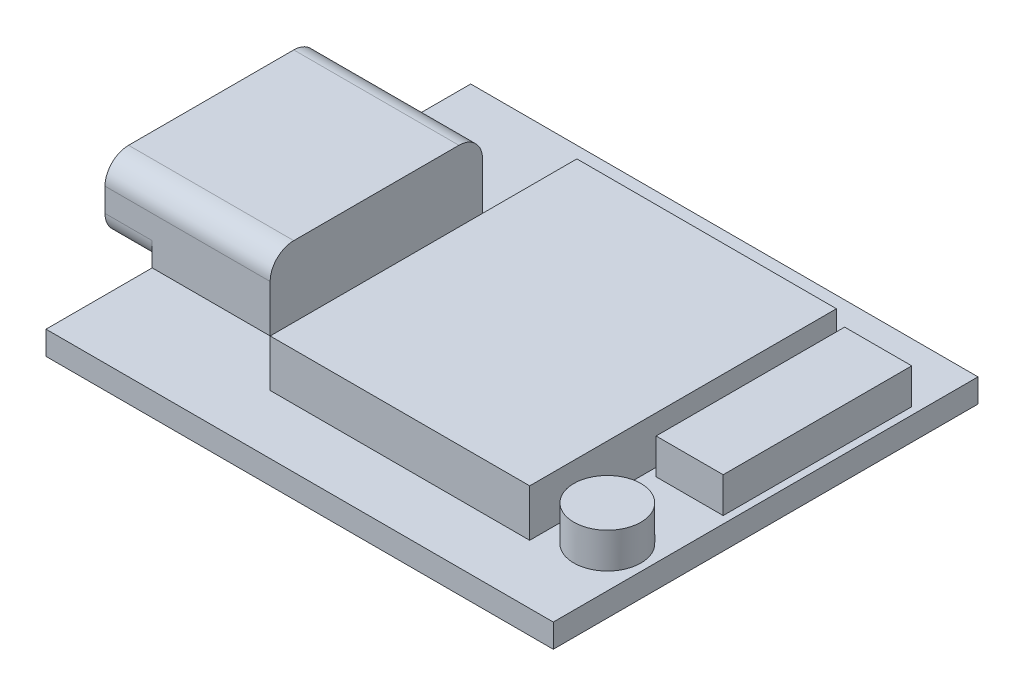
ISO-10303-21;
HEADER;
FILE_DESCRIPTION(('STEP AP214'),'2;1');
FILE_NAME('part.step','',(''),(''),'','','');
FILE_SCHEMA(('AUTOMOTIVE_DESIGN { 1 0 10303 214 1 1 1 1 }'));
ENDSEC;
DATA;
#1=APPLICATION_CONTEXT('core data for automotive mechanical design processes');
#2=APPLICATION_PROTOCOL_DEFINITION('international standard','automotive_design',2000,#1);
#3=PRODUCT_CONTEXT('',#1,'mechanical');
#4=PRODUCT('Part','Part','',(#3));
#5=PRODUCT_RELATED_PRODUCT_CATEGORY('part','',(#4));
#6=PRODUCT_DEFINITION_FORMATION('','',#4);
#7=PRODUCT_DEFINITION_CONTEXT('part definition',#1,'design');
#8=PRODUCT_DEFINITION('design','',#6,#7);
#9=PRODUCT_DEFINITION_SHAPE('','',#8);
#10=(LENGTH_UNIT() NAMED_UNIT(*) SI_UNIT(.MILLI.,.METRE.));
#11=(NAMED_UNIT(*) PLANE_ANGLE_UNIT() SI_UNIT($,.RADIAN.));
#12=(NAMED_UNIT(*) SI_UNIT($,.STERADIAN.) SOLID_ANGLE_UNIT());
#13=UNCERTAINTY_MEASURE_WITH_UNIT(LENGTH_MEASURE(1.E-05),#10,'distance_accuracy_value','');
#14=(GEOMETRIC_REPRESENTATION_CONTEXT(3) GLOBAL_UNCERTAINTY_ASSIGNED_CONTEXT((#13)) GLOBAL_UNIT_ASSIGNED_CONTEXT((#10,
#11,#12)) REPRESENTATION_CONTEXT('',''));
#15=CARTESIAN_POINT('',(0.,0.,0.));
#16=DIRECTION('',(0.,0.,1.));
#17=DIRECTION('',(1.,0.,0.));
#18=AXIS2_PLACEMENT_3D('',#15,#16,#17);
#19=CARTESIAN_POINT('',(0.,1.,0.));
#20=DIRECTION('',(0.,-1.,0.));
#21=DIRECTION('',(0.,0.,-1.));
#22=AXIS2_PLACEMENT_3D('',#19,#20,#21);
#23=PLANE('',#22);
#24=CARTESIAN_POINT('',(9.02059135131175,1.,4.97840063316199));
#25=DIRECTION('',(0.,-1.,0.));
#26=DIRECTION('',(0.,0.,-1.));
#27=AXIS2_PLACEMENT_3D('',#24,#25,#26);
#28=CIRCLE('',#27,1.42148493775175);
#29=CARTESIAN_POINT('',(9.02059135131175,1.,3.55691569541023));
#30=VERTEX_POINT('',#29);
#31=EDGE_CURVE('E11',#30,#30,#28,.F.);
#32=ORIENTED_EDGE('',*,*,#31,.F.);
#33=EDGE_LOOP('',(#32));
#34=FACE_BOUND('',#33,.T.);
#35=DIRECTION('',(0.,0.,1.));
#36=VECTOR('',#35,1.);
#37=CARTESIAN_POINT('',(-3.75,1.,6.5));
#38=LINE('',#37,#36);
#39=CARTESIAN_POINT('',(-3.75,1.,-6.5));
#40=VERTEX_POINT('',#39);
#41=CARTESIAN_POINT('',(-3.75,1.,6.5));
#42=VERTEX_POINT('',#41);
#43=EDGE_CURVE('E209',#40,#42,#38,.T.);
#44=ORIENTED_EDGE('',*,*,#43,.F.);
#45=DIRECTION('',(-1.,0.,0.));
#46=VECTOR('',#45,1.);
#47=CARTESIAN_POINT('',(7.25,1.,-6.5));
#48=LINE('',#47,#46);
#49=CARTESIAN_POINT('',(7.25,1.,-6.5));
#50=VERTEX_POINT('',#49);
#51=EDGE_CURVE('E222',#50,#40,#48,.T.);
#52=ORIENTED_EDGE('',*,*,#51,.F.);
#53=DIRECTION('',(0.,0.,-1.));
#54=VECTOR('',#53,1.);
#55=CARTESIAN_POINT('',(7.25,1.,6.5));
#56=LINE('',#55,#54);
#57=CARTESIAN_POINT('',(7.25,1.,6.5));
#58=VERTEX_POINT('',#57);
#59=EDGE_CURVE('E231',#58,#50,#56,.T.);
#60=ORIENTED_EDGE('',*,*,#59,.F.);
#61=DIRECTION('',(1.,0.,0.));
#62=VECTOR('',#61,1.);
#63=CARTESIAN_POINT('',(7.25,1.,6.5));
#64=LINE('',#63,#62);
#65=EDGE_CURVE('E212',#42,#58,#64,.T.);
#66=ORIENTED_EDGE('',*,*,#65,.F.);
#67=EDGE_LOOP('',(#44,#52,#60,#66));
#68=FACE_BOUND('',#67,.T.);
#69=DIRECTION('',(-1.,0.,0.));
#70=VECTOR('',#69,1.);
#71=CARTESIAN_POINT('',(-12.75,1.,-4.5));
#72=LINE('',#71,#70);
#73=CARTESIAN_POINT('',(-5.75,1.,-4.5));
#74=VERTEX_POINT('',#73);
#75=CARTESIAN_POINT('',(-10.75,1.,-4.5));
#76=VERTEX_POINT('',#75);
#77=EDGE_CURVE('E252',#74,#76,#72,.T.);
#78=ORIENTED_EDGE('',*,*,#77,.F.);
#79=DIRECTION('',(0.,0.,-1.));
#80=VECTOR('',#79,1.);
#81=CARTESIAN_POINT('',(-5.75,1.,-4.5));
#82=LINE('',#81,#80);
#83=CARTESIAN_POINT('',(-5.75,1.,4.5));
#84=VERTEX_POINT('',#83);
#85=EDGE_CURVE('E258',#84,#74,#82,.T.);
#86=ORIENTED_EDGE('',*,*,#85,.F.);
#87=DIRECTION('',(1.,0.,0.));
#88=VECTOR('',#87,1.);
#89=CARTESIAN_POINT('',(-12.75,1.,4.5));
#90=LINE('',#89,#88);
#91=CARTESIAN_POINT('',(-10.75,1.,4.5));
#92=VERTEX_POINT('',#91);
#93=EDGE_CURVE('E259',#92,#84,#90,.T.);
#94=ORIENTED_EDGE('',*,*,#93,.F.);
#95=DIRECTION('',(0.,0.,1.));
#96=VECTOR('',#95,1.);
#97=CARTESIAN_POINT('',(-10.75,1.,-9.));
#98=LINE('',#97,#96);
#99=CARTESIAN_POINT('',(-10.75,1.,9.));
#100=VERTEX_POINT('',#99);
#101=EDGE_CURVE('E283',#92,#100,#98,.T.);
#102=ORIENTED_EDGE('',*,*,#101,.T.);
#103=DIRECTION('',(1.,0.,0.));
#104=VECTOR('',#103,1.);
#105=CARTESIAN_POINT('',(10.75,1.,9.));
#106=LINE('',#105,#104);
#107=CARTESIAN_POINT('',(10.75,1.,9.));
#108=VERTEX_POINT('',#107);
#109=EDGE_CURVE('E281',#100,#108,#106,.T.);
#110=ORIENTED_EDGE('',*,*,#109,.T.);
#111=DIRECTION('',(0.,0.,-1.));
#112=VECTOR('',#111,1.);
#113=CARTESIAN_POINT('',(10.75,1.,-9.));
#114=LINE('',#113,#112);
#115=CARTESIAN_POINT('',(10.75,1.,-9.));
#116=VERTEX_POINT('',#115);
#117=EDGE_CURVE('E285',#108,#116,#114,.T.);
#118=ORIENTED_EDGE('',*,*,#117,.T.);
#119=DIRECTION('',(-1.,0.,0.));
#120=VECTOR('',#119,1.);
#121=CARTESIAN_POINT('',(10.75,1.,-9.));
#122=LINE('',#121,#120);
#123=CARTESIAN_POINT('',(-10.75,1.,-9.));
#124=VERTEX_POINT('',#123);
#125=EDGE_CURVE('E287',#116,#124,#122,.T.);
#126=ORIENTED_EDGE('',*,*,#125,.T.);
#127=EDGE_CURVE('E278',#124,#76,#98,.T.);
#128=ORIENTED_EDGE('',*,*,#127,.T.);
#129=EDGE_LOOP('',(#78,#86,#94,#102,#110,#118,#126,#128));
#130=FACE_BOUND('',#129,.T.);
#131=DIRECTION('',(0.,0.,1.));
#132=VECTOR('',#131,1.);
#133=CARTESIAN_POINT('',(7.59910641356,1.,-6.5));
#134=LINE('',#133,#132);
#135=CARTESIAN_POINT('',(7.59910641356,1.,-6.5));
#136=VERTEX_POINT('',#135);
#137=CARTESIAN_POINT('',(7.59910641356,1.,1.49168172480123));
#138=VERTEX_POINT('',#137);
#139=EDGE_CURVE('E208',#136,#138,#134,.T.);
#140=ORIENTED_EDGE('',*,*,#139,.F.);
#141=DIRECTION('',(-1.,0.,0.));
#142=VECTOR('',#141,1.);
#143=CARTESIAN_POINT('',(7.59910641356,1.,-6.5));
#144=LINE('',#143,#142);
#145=CARTESIAN_POINT('',(10.4420762890635,1.,-6.5));
#146=VERTEX_POINT('',#145);
#147=EDGE_CURVE('E205',#146,#136,#144,.T.);
#148=ORIENTED_EDGE('',*,*,#147,.F.);
#149=DIRECTION('',(0.,0.,-1.));
#150=VECTOR('',#149,1.);
#151=CARTESIAN_POINT('',(10.4420762890635,1.,-6.5));
#152=LINE('',#151,#150);
#153=CARTESIAN_POINT('',(10.4420762890635,1.,1.49168172480123));
#154=VERTEX_POINT('',#153);
#155=EDGE_CURVE('E59',#154,#146,#152,.T.);
#156=ORIENTED_EDGE('',*,*,#155,.F.);
#157=DIRECTION('',(1.,0.,0.));
#158=VECTOR('',#157,1.);
#159=CARTESIAN_POINT('',(7.59910641356,1.,1.49168172480123));
#160=LINE('',#159,#158);
#161=EDGE_CURVE('E54',#138,#154,#160,.T.);
#162=ORIENTED_EDGE('',*,*,#161,.F.);
#163=EDGE_LOOP('',(#140,#148,#156,#162));
#164=FACE_BOUND('',#163,.T.);
#165=ADVANCED_FACE('F39',(#34,#68,#130,#164),#23,.F.);
#166=CARTESIAN_POINT('',(-10.75,1.,-9.));
#167=DIRECTION('',(1.,0.,0.));
#168=DIRECTION('',(0.,0.,-1.));
#169=AXIS2_PLACEMENT_3D('',#166,#167,#168);
#170=PLANE('',#169);
#171=DIRECTION('',(0.,0.,1.));
#172=VECTOR('',#171,1.);
#173=CARTESIAN_POINT('',(-10.75,0.,-9.));
#174=LINE('',#173,#172);
#175=CARTESIAN_POINT('',(-10.75,0.,-9.));
#176=VERTEX_POINT('',#175);
#177=CARTESIAN_POINT('',(-10.75,0.,9.));
#178=VERTEX_POINT('',#177);
#179=EDGE_CURVE('E277',#176,#178,#174,.T.);
#180=ORIENTED_EDGE('',*,*,#179,.T.);
#181=DIRECTION('',(0.,-1.,0.));
#182=VECTOR('',#181,1.);
#183=CARTESIAN_POINT('',(-10.75,1.,9.));
#184=LINE('',#183,#182);
#185=EDGE_CURVE('E263',#100,#178,#184,.T.);
#186=ORIENTED_EDGE('',*,*,#185,.F.);
#187=ORIENTED_EDGE('',*,*,#101,.F.);
#188=DIRECTION('',(0.,-1.,0.));
#189=VECTOR('',#188,1.);
#190=CARTESIAN_POINT('',(-10.75,4.,4.5));
#191=LINE('',#190,#189);
#192=CARTESIAN_POINT('',(-10.75,2.,4.5));
#193=VERTEX_POINT('',#192);
#194=EDGE_CURVE('E329',#193,#92,#191,.T.);
#195=ORIENTED_EDGE('',*,*,#194,.F.);
#196=CARTESIAN_POINT('',(-10.75,2.,3.5));
#197=DIRECTION('',(1.,0.,0.));
#198=DIRECTION('',(0.,0.,-1.));
#199=AXIS2_PLACEMENT_3D('',#196,#197,#198);
#200=CIRCLE('',#199,1.);
#201=CARTESIAN_POINT('',(-10.75,1.,3.5));
#202=VERTEX_POINT('',#201);
#203=EDGE_CURVE('E47',#193,#202,#200,.T.);
#204=ORIENTED_EDGE('',*,*,#203,.T.);
#205=CARTESIAN_POINT('',(-10.75,1.,-3.5));
#206=VERTEX_POINT('',#205);
#207=EDGE_CURVE('E282',#206,#202,#98,.T.);
#208=ORIENTED_EDGE('',*,*,#207,.F.);
#209=CARTESIAN_POINT('',(-10.75,2.,-3.5));
#210=DIRECTION('',(1.,0.,0.));
#211=DIRECTION('',(0.,0.,-1.));
#212=AXIS2_PLACEMENT_3D('',#209,#210,#211);
#213=CIRCLE('',#212,1.);
#214=CARTESIAN_POINT('',(-10.75,2.,-4.5));
#215=VERTEX_POINT('',#214);
#216=EDGE_CURVE('E344',#206,#215,#213,.T.);
#217=ORIENTED_EDGE('',*,*,#216,.T.);
#218=DIRECTION('',(0.,1.,0.));
#219=VECTOR('',#218,1.);
#220=CARTESIAN_POINT('',(-10.75,4.,-4.5));
#221=LINE('',#220,#219);
#222=EDGE_CURVE('E309',#76,#215,#221,.T.);
#223=ORIENTED_EDGE('',*,*,#222,.F.);
#224=ORIENTED_EDGE('',*,*,#127,.F.);
#225=DIRECTION('',(0.,-1.,0.));
#226=VECTOR('',#225,1.);
#227=CARTESIAN_POINT('',(-10.75,1.,-9.));
#228=LINE('',#227,#226);
#229=EDGE_CURVE('E289',#124,#176,#228,.T.);
#230=ORIENTED_EDGE('',*,*,#229,.T.);
#231=EDGE_LOOP('',(#180,#186,#187,#195,#204,#208,#217,#223,#224,#230));
#232=FACE_BOUND('',#231,.T.);
#233=ADVANCED_FACE('F349',(#232),#170,.F.);
#234=CARTESIAN_POINT('',(10.75,1.,9.));
#235=DIRECTION('',(0.,0.,-1.));
#236=DIRECTION('',(-1.,0.,0.));
#237=AXIS2_PLACEMENT_3D('',#234,#235,#236);
#238=PLANE('',#237);
#239=DIRECTION('',(1.,0.,0.));
#240=VECTOR('',#239,1.);
#241=CARTESIAN_POINT('',(10.75,0.,9.));
#242=LINE('',#241,#240);
#243=CARTESIAN_POINT('',(10.75,0.,9.));
#244=VERTEX_POINT('',#243);
#245=EDGE_CURVE('E292',#178,#244,#242,.T.);
#246=ORIENTED_EDGE('',*,*,#245,.T.);
#247=DIRECTION('',(0.,-1.,0.));
#248=VECTOR('',#247,1.);
#249=CARTESIAN_POINT('',(10.75,1.,9.));
#250=LINE('',#249,#248);
#251=EDGE_CURVE('E303',#108,#244,#250,.T.);
#252=ORIENTED_EDGE('',*,*,#251,.F.);
#253=ORIENTED_EDGE('',*,*,#109,.F.);
#254=ORIENTED_EDGE('',*,*,#185,.T.);
#255=EDGE_LOOP('',(#246,#252,#253,#254));
#256=FACE_BOUND('',#255,.T.);
#257=ADVANCED_FACE('F406',(#256),#238,.F.);
#258=CARTESIAN_POINT('',(10.75,1.,-9.));
#259=DIRECTION('',(-1.,0.,0.));
#260=DIRECTION('',(0.,0.,1.));
#261=AXIS2_PLACEMENT_3D('',#258,#259,#260);
#262=PLANE('',#261);
#263=DIRECTION('',(0.,0.,-1.));
#264=VECTOR('',#263,1.);
#265=CARTESIAN_POINT('',(10.75,0.,-9.));
#266=LINE('',#265,#264);
#267=CARTESIAN_POINT('',(10.75,0.,-9.));
#268=VERTEX_POINT('',#267);
#269=EDGE_CURVE('E294',#244,#268,#266,.T.);
#270=ORIENTED_EDGE('',*,*,#269,.T.);
#271=DIRECTION('',(0.,-1.,0.));
#272=VECTOR('',#271,1.);
#273=CARTESIAN_POINT('',(10.75,1.,-9.));
#274=LINE('',#273,#272);
#275=EDGE_CURVE('E300',#116,#268,#274,.T.);
#276=ORIENTED_EDGE('',*,*,#275,.F.);
#277=ORIENTED_EDGE('',*,*,#117,.F.);
#278=ORIENTED_EDGE('',*,*,#251,.T.);
#279=EDGE_LOOP('',(#270,#276,#277,#278));
#280=FACE_BOUND('',#279,.T.);
#281=ADVANCED_FACE('F433',(#280),#262,.F.);
#282=CARTESIAN_POINT('',(10.75,1.,-9.));
#283=DIRECTION('',(0.,0.,1.));
#284=DIRECTION('',(1.,0.,0.));
#285=AXIS2_PLACEMENT_3D('',#282,#283,#284);
#286=PLANE('',#285);
#287=DIRECTION('',(-1.,0.,0.));
#288=VECTOR('',#287,1.);
#289=CARTESIAN_POINT('',(10.75,0.,-9.));
#290=LINE('',#289,#288);
#291=EDGE_CURVE('E296',#268,#176,#290,.T.);
#292=ORIENTED_EDGE('',*,*,#291,.T.);
#293=ORIENTED_EDGE('',*,*,#229,.F.);
#294=ORIENTED_EDGE('',*,*,#125,.F.);
#295=ORIENTED_EDGE('',*,*,#275,.T.);
#296=EDGE_LOOP('',(#292,#293,#294,#295));
#297=FACE_BOUND('',#296,.T.);
#298=ADVANCED_FACE('F396',(#297),#286,.F.);
#299=CARTESIAN_POINT('',(0.,0.,0.));
#300=DIRECTION('',(0.,-1.,0.));
#301=DIRECTION('',(0.,0.,-1.));
#302=AXIS2_PLACEMENT_3D('',#299,#300,#301);
#303=PLANE('',#302);
#304=ORIENTED_EDGE('',*,*,#179,.F.);
#305=ORIENTED_EDGE('',*,*,#291,.F.);
#306=ORIENTED_EDGE('',*,*,#269,.F.);
#307=ORIENTED_EDGE('',*,*,#245,.F.);
#308=EDGE_LOOP('',(#304,#305,#306,#307));
#309=FACE_BOUND('',#308,.T.);
#310=ADVANCED_FACE('F401',(#309),#303,.T.);
#311=CARTESIAN_POINT('',(0.,1.,0.));
#312=DIRECTION('',(0.,1.,0.));
#313=DIRECTION('',(0.,0.,1.));
#314=AXIS2_PLACEMENT_3D('',#311,#312,#313);
#315=PLANE('',#314);
#316=DIRECTION('',(0.,0.,1.));
#317=VECTOR('',#316,1.);
#318=CARTESIAN_POINT('',(-12.75,1.,-4.5));
#319=LINE('',#318,#317);
#320=CARTESIAN_POINT('',(-12.75,1.,-3.5));
#321=VERTEX_POINT('',#320);
#322=CARTESIAN_POINT('',(-12.75,1.,3.5));
#323=VERTEX_POINT('',#322);
#324=EDGE_CURVE('E247',#321,#323,#319,.T.);
#325=ORIENTED_EDGE('',*,*,#324,.F.);
#326=DIRECTION('',(-1.,0.,0.));
#327=VECTOR('',#326,1.);
#328=CARTESIAN_POINT('',(0.,1.,-3.5));
#329=LINE('',#328,#327);
#330=EDGE_CURVE('E325',#321,#206,#329,.F.);
#331=ORIENTED_EDGE('',*,*,#330,.T.);
#332=ORIENTED_EDGE('',*,*,#207,.T.);
#333=DIRECTION('',(1.,0.,0.));
#334=VECTOR('',#333,1.);
#335=CARTESIAN_POINT('',(0.,1.,3.5));
#336=LINE('',#335,#334);
#337=EDGE_CURVE('E323',#202,#323,#336,.F.);
#338=ORIENTED_EDGE('',*,*,#337,.T.);
#339=EDGE_LOOP('',(#325,#331,#332,#338));
#340=FACE_BOUND('',#339,.T.);
#341=ADVANCED_FACE('F357',(#340),#315,.F.);
#342=CARTESIAN_POINT('',(-12.75,4.,-4.5));
#343=DIRECTION('',(1.,0.,0.));
#344=DIRECTION('',(0.,0.,-1.));
#345=AXIS2_PLACEMENT_3D('',#342,#343,#344);
#346=PLANE('',#345);
#347=DIRECTION('',(0.,-1.,0.));
#348=VECTOR('',#347,1.);
#349=CARTESIAN_POINT('',(-12.75,4.,-4.5));
#350=LINE('',#349,#348);
#351=CARTESIAN_POINT('',(-12.75,3.,-4.5));
#352=VERTEX_POINT('',#351);
#353=CARTESIAN_POINT('',(-12.75,2.,-4.5));
#354=VERTEX_POINT('',#353);
#355=EDGE_CURVE('E255',#352,#354,#350,.T.);
#356=ORIENTED_EDGE('',*,*,#355,.T.);
#357=CARTESIAN_POINT('',(-12.75,2.,-3.5));
#358=DIRECTION('',(1.,0.,0.));
#359=DIRECTION('',(0.,0.,-1.));
#360=AXIS2_PLACEMENT_3D('',#357,#358,#359);
#361=CIRCLE('',#360,1.);
#362=EDGE_CURVE('E321',#354,#321,#361,.F.);
#363=ORIENTED_EDGE('',*,*,#362,.T.);
#364=ORIENTED_EDGE('',*,*,#324,.T.);
#365=CARTESIAN_POINT('',(-12.75,2.,3.5));
#366=DIRECTION('',(1.,0.,0.));
#367=DIRECTION('',(0.,0.,-1.));
#368=AXIS2_PLACEMENT_3D('',#365,#366,#367);
#369=CIRCLE('',#368,1.);
#370=CARTESIAN_POINT('',(-12.75,2.,4.5));
#371=VERTEX_POINT('',#370);
#372=EDGE_CURVE('E319',#323,#371,#369,.F.);
#373=ORIENTED_EDGE('',*,*,#372,.T.);
#374=DIRECTION('',(0.,-1.,0.));
#375=VECTOR('',#374,1.);
#376=CARTESIAN_POINT('',(-12.75,4.,4.5));
#377=LINE('',#376,#375);
#378=CARTESIAN_POINT('',(-12.75,3.,4.5));
#379=VERTEX_POINT('',#378);
#380=EDGE_CURVE('E274',#379,#371,#377,.T.);
#381=ORIENTED_EDGE('',*,*,#380,.F.);
#382=CARTESIAN_POINT('',(-12.75,3.,3.5));
#383=DIRECTION('',(1.,0.,0.));
#384=DIRECTION('',(0.,0.,-1.));
#385=AXIS2_PLACEMENT_3D('',#382,#383,#384);
#386=CIRCLE('',#385,1.);
#387=CARTESIAN_POINT('',(-12.75,4.,3.5));
#388=VERTEX_POINT('',#387);
#389=EDGE_CURVE('E315',#379,#388,#386,.F.);
#390=ORIENTED_EDGE('',*,*,#389,.T.);
#391=DIRECTION('',(0.,0.,1.));
#392=VECTOR('',#391,1.);
#393=CARTESIAN_POINT('',(-12.75,4.,-4.5));
#394=LINE('',#393,#392);
#395=CARTESIAN_POINT('',(-12.75,4.,-3.5));
#396=VERTEX_POINT('',#395);
#397=EDGE_CURVE('E248',#396,#388,#394,.T.);
#398=ORIENTED_EDGE('',*,*,#397,.F.);
#399=CARTESIAN_POINT('',(-12.75,3.,-3.5));
#400=DIRECTION('',(1.,0.,0.));
#401=DIRECTION('',(0.,0.,-1.));
#402=AXIS2_PLACEMENT_3D('',#399,#400,#401);
#403=CIRCLE('',#402,1.);
#404=EDGE_CURVE('E317',#396,#352,#403,.F.);
#405=ORIENTED_EDGE('',*,*,#404,.T.);
#406=EDGE_LOOP('',(#356,#363,#364,#373,#381,#390,#398,#405));
#407=FACE_BOUND('',#406,.T.);
#408=ADVANCED_FACE('F363',(#407),#346,.F.);
#409=CARTESIAN_POINT('',(-12.75,4.,4.5));
#410=DIRECTION('',(0.,0.,-1.));
#411=DIRECTION('',(-1.,0.,0.));
#412=AXIS2_PLACEMENT_3D('',#409,#410,#411);
#413=PLANE('',#412);
#414=ORIENTED_EDGE('',*,*,#380,.T.);
#415=DIRECTION('',(1.,0.,0.));
#416=VECTOR('',#415,1.);
#417=CARTESIAN_POINT('',(-12.75,2.,4.5));
#418=LINE('',#417,#416);
#419=EDGE_CURVE('E331',#371,#193,#418,.T.);
#420=ORIENTED_EDGE('',*,*,#419,.T.);
#421=ORIENTED_EDGE('',*,*,#194,.T.);
#422=ORIENTED_EDGE('',*,*,#93,.T.);
#423=DIRECTION('',(0.,-1.,0.));
#424=VECTOR('',#423,1.);
#425=CARTESIAN_POINT('',(-5.75,4.,4.5));
#426=LINE('',#425,#424);
#427=CARTESIAN_POINT('',(-5.75,3.,4.5));
#428=VERTEX_POINT('',#427);
#429=EDGE_CURVE('E272',#428,#84,#426,.T.);
#430=ORIENTED_EDGE('',*,*,#429,.F.);
#431=DIRECTION('',(1.,0.,0.));
#432=VECTOR('',#431,1.);
#433=CARTESIAN_POINT('',(-12.75,3.,4.5));
#434=LINE('',#433,#432);
#435=EDGE_CURVE('E327',#428,#379,#434,.F.);
#436=ORIENTED_EDGE('',*,*,#435,.T.);
#437=EDGE_LOOP('',(#414,#420,#421,#422,#430,#436));
#438=FACE_BOUND('',#437,.T.);
#439=ADVANCED_FACE('F366',(#438),#413,.F.);
#440=CARTESIAN_POINT('',(-5.75,4.,-4.5));
#441=DIRECTION('',(-1.,0.,0.));
#442=DIRECTION('',(0.,0.,1.));
#443=AXIS2_PLACEMENT_3D('',#440,#441,#442);
#444=PLANE('',#443);
#445=DIRECTION('',(0.,-1.,0.));
#446=VECTOR('',#445,1.);
#447=CARTESIAN_POINT('',(-5.75,4.,-4.5));
#448=LINE('',#447,#446);
#449=CARTESIAN_POINT('',(-5.75,3.,-4.5));
#450=VERTEX_POINT('',#449);
#451=EDGE_CURVE('E270',#450,#74,#448,.T.);
#452=ORIENTED_EDGE('',*,*,#451,.F.);
#453=CARTESIAN_POINT('',(-5.75,3.,-3.5));
#454=DIRECTION('',(-1.,0.,0.));
#455=DIRECTION('',(0.,0.,1.));
#456=AXIS2_PLACEMENT_3D('',#453,#454,#455);
#457=CIRCLE('',#456,1.);
#458=CARTESIAN_POINT('',(-5.75,4.,-3.5));
#459=VERTEX_POINT('',#458);
#460=EDGE_CURVE('E342',#450,#459,#457,.F.);
#461=ORIENTED_EDGE('',*,*,#460,.T.);
#462=DIRECTION('',(0.,0.,-1.));
#463=VECTOR('',#462,1.);
#464=CARTESIAN_POINT('',(-5.75,4.,-4.5));
#465=LINE('',#464,#463);
#466=CARTESIAN_POINT('',(-5.75,4.,3.5));
#467=VERTEX_POINT('',#466);
#468=EDGE_CURVE('E251',#467,#459,#465,.T.);
#469=ORIENTED_EDGE('',*,*,#468,.F.);
#470=CARTESIAN_POINT('',(-5.75,3.,3.5));
#471=DIRECTION('',(-1.,0.,0.));
#472=DIRECTION('',(0.,0.,1.));
#473=AXIS2_PLACEMENT_3D('',#470,#471,#472);
#474=CIRCLE('',#473,1.);
#475=EDGE_CURVE('E340',#467,#428,#474,.F.);
#476=ORIENTED_EDGE('',*,*,#475,.T.);
#477=ORIENTED_EDGE('',*,*,#429,.T.);
#478=ORIENTED_EDGE('',*,*,#85,.T.);
#479=EDGE_LOOP('',(#452,#461,#469,#476,#477,#478));
#480=FACE_BOUND('',#479,.T.);
#481=ADVANCED_FACE('F409',(#480),#444,.F.);
#482=CARTESIAN_POINT('',(-12.75,4.,-4.5));
#483=DIRECTION('',(0.,0.,1.));
#484=DIRECTION('',(1.,0.,0.));
#485=AXIS2_PLACEMENT_3D('',#482,#483,#484);
#486=PLANE('',#485);
#487=ORIENTED_EDGE('',*,*,#222,.T.);
#488=DIRECTION('',(-1.,0.,0.));
#489=VECTOR('',#488,1.);
#490=CARTESIAN_POINT('',(-12.75,2.,-4.5));
#491=LINE('',#490,#489);
#492=EDGE_CURVE('E312',#215,#354,#491,.T.);
#493=ORIENTED_EDGE('',*,*,#492,.T.);
#494=ORIENTED_EDGE('',*,*,#355,.F.);
#495=DIRECTION('',(-1.,0.,0.));
#496=VECTOR('',#495,1.);
#497=CARTESIAN_POINT('',(-5.75,3.,-4.5));
#498=LINE('',#497,#496);
#499=EDGE_CURVE('E262',#352,#450,#498,.F.);
#500=ORIENTED_EDGE('',*,*,#499,.T.);
#501=ORIENTED_EDGE('',*,*,#451,.T.);
#502=ORIENTED_EDGE('',*,*,#77,.T.);
#503=EDGE_LOOP('',(#487,#493,#494,#500,#501,#502));
#504=FACE_BOUND('',#503,.T.);
#505=ADVANCED_FACE('F382',(#504),#486,.F.);
#506=CARTESIAN_POINT('',(0.,4.,0.));
#507=DIRECTION('',(0.,1.,0.));
#508=DIRECTION('',(0.,0.,1.));
#509=AXIS2_PLACEMENT_3D('',#506,#507,#508);
#510=PLANE('',#509);
#511=ORIENTED_EDGE('',*,*,#468,.T.);
#512=DIRECTION('',(-1.,0.,0.));
#513=VECTOR('',#512,1.);
#514=CARTESIAN_POINT('',(-12.75,4.,-3.5));
#515=LINE('',#514,#513);
#516=EDGE_CURVE('E337',#459,#396,#515,.T.);
#517=ORIENTED_EDGE('',*,*,#516,.T.);
#518=ORIENTED_EDGE('',*,*,#397,.T.);
#519=DIRECTION('',(1.,0.,0.));
#520=VECTOR('',#519,1.);
#521=CARTESIAN_POINT('',(-5.75,4.,3.5));
#522=LINE('',#521,#520);
#523=EDGE_CURVE('E334',#388,#467,#522,.T.);
#524=ORIENTED_EDGE('',*,*,#523,.T.);
#525=EDGE_LOOP('',(#511,#517,#518,#524));
#526=FACE_BOUND('',#525,.T.);
#527=ADVANCED_FACE('F373',(#526),#510,.T.);
#528=CARTESIAN_POINT('',(-12.75,2.,-3.5));
#529=DIRECTION('',(-1.,0.,0.));
#530=DIRECTION('',(0.,0.,1.));
#531=AXIS2_PLACEMENT_3D('',#528,#529,#530);
#532=CYLINDRICAL_SURFACE('',#531,1.);
#533=ORIENTED_EDGE('',*,*,#216,.F.);
#534=ORIENTED_EDGE('',*,*,#330,.F.);
#535=ORIENTED_EDGE('',*,*,#362,.F.);
#536=ORIENTED_EDGE('',*,*,#492,.F.);
#537=EDGE_LOOP('',(#533,#534,#535,#536));
#538=FACE_BOUND('',#537,.T.);
#539=ADVANCED_FACE('F386',(#538),#532,.T.);
#540=CARTESIAN_POINT('',(-12.75,2.,3.5));
#541=DIRECTION('',(1.,0.,0.));
#542=DIRECTION('',(0.,0.,-1.));
#543=AXIS2_PLACEMENT_3D('',#540,#541,#542);
#544=CYLINDRICAL_SURFACE('',#543,1.);
#545=ORIENTED_EDGE('',*,*,#372,.F.);
#546=ORIENTED_EDGE('',*,*,#337,.F.);
#547=ORIENTED_EDGE('',*,*,#203,.F.);
#548=ORIENTED_EDGE('',*,*,#419,.F.);
#549=EDGE_LOOP('',(#545,#546,#547,#548));
#550=FACE_BOUND('',#549,.T.);
#551=ADVANCED_FACE('F360',(#550),#544,.T.);
#552=CARTESIAN_POINT('',(0.,3.,-3.5));
#553=DIRECTION('',(1.,0.,0.));
#554=DIRECTION('',(0.,0.,-1.));
#555=AXIS2_PLACEMENT_3D('',#552,#553,#554);
#556=CYLINDRICAL_SURFACE('',#555,1.);
#557=ORIENTED_EDGE('',*,*,#460,.F.);
#558=ORIENTED_EDGE('',*,*,#499,.F.);
#559=ORIENTED_EDGE('',*,*,#404,.F.);
#560=ORIENTED_EDGE('',*,*,#516,.F.);
#561=EDGE_LOOP('',(#557,#558,#559,#560));
#562=FACE_BOUND('',#561,.T.);
#563=ADVANCED_FACE('F378',(#562),#556,.T.);
#564=CARTESIAN_POINT('',(0.,3.,3.5));
#565=DIRECTION('',(-1.,0.,0.));
#566=DIRECTION('',(0.,0.,1.));
#567=AXIS2_PLACEMENT_3D('',#564,#565,#566);
#568=CYLINDRICAL_SURFACE('',#567,1.);
#569=ORIENTED_EDGE('',*,*,#389,.F.);
#570=ORIENTED_EDGE('',*,*,#435,.F.);
#571=ORIENTED_EDGE('',*,*,#475,.F.);
#572=ORIENTED_EDGE('',*,*,#523,.F.);
#573=EDGE_LOOP('',(#569,#570,#571,#572));
#574=FACE_BOUND('',#573,.T.);
#575=ADVANCED_FACE('F41',(#574),#568,.T.);
#576=CARTESIAN_POINT('',(-3.75,3.,6.5));
#577=DIRECTION('',(1.,0.,0.));
#578=DIRECTION('',(0.,0.,-1.));
#579=AXIS2_PLACEMENT_3D('',#576,#577,#578);
#580=PLANE('',#579);
#581=ORIENTED_EDGE('',*,*,#43,.T.);
#582=DIRECTION('',(0.,-1.,0.));
#583=VECTOR('',#582,1.);
#584=CARTESIAN_POINT('',(-3.75,3.,6.5));
#585=LINE('',#584,#583);
#586=CARTESIAN_POINT('',(-3.75,3.,6.5));
#587=VERTEX_POINT('',#586);
#588=EDGE_CURVE('E244',#587,#42,#585,.T.);
#589=ORIENTED_EDGE('',*,*,#588,.F.);
#590=DIRECTION('',(0.,0.,1.));
#591=VECTOR('',#590,1.);
#592=CARTESIAN_POINT('',(-3.75,3.,6.5));
#593=LINE('',#592,#591);
#594=CARTESIAN_POINT('',(-3.75,3.,-6.5));
#595=VERTEX_POINT('',#594);
#596=EDGE_CURVE('E218',#595,#587,#593,.T.);
#597=ORIENTED_EDGE('',*,*,#596,.F.);
#598=DIRECTION('',(0.,-1.,0.));
#599=VECTOR('',#598,1.);
#600=CARTESIAN_POINT('',(-3.75,3.,-6.5));
#601=LINE('',#600,#599);
#602=EDGE_CURVE('E227',#595,#40,#601,.T.);
#603=ORIENTED_EDGE('',*,*,#602,.T.);
#604=EDGE_LOOP('',(#581,#589,#597,#603));
#605=FACE_BOUND('',#604,.T.);
#606=ADVANCED_FACE('F446',(#605),#580,.F.);
#607=CARTESIAN_POINT('',(7.25,3.,6.5));
#608=DIRECTION('',(0.,0.,-1.));
#609=DIRECTION('',(-1.,0.,0.));
#610=AXIS2_PLACEMENT_3D('',#607,#608,#609);
#611=PLANE('',#610);
#612=ORIENTED_EDGE('',*,*,#65,.T.);
#613=DIRECTION('',(0.,-1.,0.));
#614=VECTOR('',#613,1.);
#615=CARTESIAN_POINT('',(7.25,3.,6.5));
#616=LINE('',#615,#614);
#617=CARTESIAN_POINT('',(7.25,3.,6.5));
#618=VERTEX_POINT('',#617);
#619=EDGE_CURVE('E241',#618,#58,#616,.T.);
#620=ORIENTED_EDGE('',*,*,#619,.F.);
#621=DIRECTION('',(1.,0.,0.));
#622=VECTOR('',#621,1.);
#623=CARTESIAN_POINT('',(7.25,3.,6.5));
#624=LINE('',#623,#622);
#625=EDGE_CURVE('E221',#587,#618,#624,.T.);
#626=ORIENTED_EDGE('',*,*,#625,.F.);
#627=ORIENTED_EDGE('',*,*,#588,.T.);
#628=EDGE_LOOP('',(#612,#620,#626,#627));
#629=FACE_BOUND('',#628,.T.);
#630=ADVANCED_FACE('F450',(#629),#611,.F.);
#631=CARTESIAN_POINT('',(7.25,3.,6.5));
#632=DIRECTION('',(-1.,0.,0.));
#633=DIRECTION('',(0.,0.,1.));
#634=AXIS2_PLACEMENT_3D('',#631,#632,#633);
#635=PLANE('',#634);
#636=ORIENTED_EDGE('',*,*,#59,.T.);
#637=DIRECTION('',(0.,-1.,0.));
#638=VECTOR('',#637,1.);
#639=CARTESIAN_POINT('',(7.25,3.,-6.5));
#640=LINE('',#639,#638);
#641=CARTESIAN_POINT('',(7.25,3.,-6.5));
#642=VERTEX_POINT('',#641);
#643=EDGE_CURVE('E238',#642,#50,#640,.T.);
#644=ORIENTED_EDGE('',*,*,#643,.F.);
#645=DIRECTION('',(0.,0.,-1.));
#646=VECTOR('',#645,1.);
#647=CARTESIAN_POINT('',(7.25,3.,6.5));
#648=LINE('',#647,#646);
#649=EDGE_CURVE('E224',#618,#642,#648,.T.);
#650=ORIENTED_EDGE('',*,*,#649,.F.);
#651=ORIENTED_EDGE('',*,*,#619,.T.);
#652=EDGE_LOOP('',(#636,#644,#650,#651));
#653=FACE_BOUND('',#652,.T.);
#654=ADVANCED_FACE('F456',(#653),#635,.F.);
#655=CARTESIAN_POINT('',(7.25,3.,-6.5));
#656=DIRECTION('',(0.,0.,1.));
#657=DIRECTION('',(1.,0.,0.));
#658=AXIS2_PLACEMENT_3D('',#655,#656,#657);
#659=PLANE('',#658);
#660=ORIENTED_EDGE('',*,*,#51,.T.);
#661=ORIENTED_EDGE('',*,*,#602,.F.);
#662=DIRECTION('',(-1.,0.,0.));
#663=VECTOR('',#662,1.);
#664=CARTESIAN_POINT('',(7.25,3.,-6.5));
#665=LINE('',#664,#663);
#666=EDGE_CURVE('E226',#642,#595,#665,.T.);
#667=ORIENTED_EDGE('',*,*,#666,.F.);
#668=ORIENTED_EDGE('',*,*,#643,.T.);
#669=EDGE_LOOP('',(#660,#661,#667,#668));
#670=FACE_BOUND('',#669,.T.);
#671=ADVANCED_FACE('F538',(#670),#659,.F.);
#672=CARTESIAN_POINT('',(0.,3.,0.));
#673=DIRECTION('',(0.,1.,0.));
#674=DIRECTION('',(0.,0.,1.));
#675=AXIS2_PLACEMENT_3D('',#672,#673,#674);
#676=PLANE('',#675);
#677=ORIENTED_EDGE('',*,*,#596,.T.);
#678=ORIENTED_EDGE('',*,*,#625,.T.);
#679=ORIENTED_EDGE('',*,*,#649,.T.);
#680=ORIENTED_EDGE('',*,*,#666,.T.);
#681=EDGE_LOOP('',(#677,#678,#679,#680));
#682=FACE_BOUND('',#681,.T.);
#683=ADVANCED_FACE('F548',(#682),#676,.T.);
#684=CARTESIAN_POINT('',(7.59910641356,2.5,-6.5));
#685=DIRECTION('',(1.,0.,0.));
#686=DIRECTION('',(0.,0.,-1.));
#687=AXIS2_PLACEMENT_3D('',#684,#685,#686);
#688=PLANE('',#687);
#689=ORIENTED_EDGE('',*,*,#139,.T.);
#690=DIRECTION('',(0.,-1.,0.));
#691=VECTOR('',#690,1.);
#692=CARTESIAN_POINT('',(7.59910641356,2.5,1.49168172480123));
#693=LINE('',#692,#691);
#694=CARTESIAN_POINT('',(7.59910641356,2.5,1.49168172480123));
#695=VERTEX_POINT('',#694);
#696=EDGE_CURVE('E189',#695,#138,#693,.T.);
#697=ORIENTED_EDGE('',*,*,#696,.F.);
#698=DIRECTION('',(0.,0.,1.));
#699=VECTOR('',#698,1.);
#700=CARTESIAN_POINT('',(7.59910641356,2.5,-6.5));
#701=LINE('',#700,#699);
#702=CARTESIAN_POINT('',(7.59910641356,2.5,-6.5));
#703=VERTEX_POINT('',#702);
#704=EDGE_CURVE('E196',#703,#695,#701,.T.);
#705=ORIENTED_EDGE('',*,*,#704,.F.);
#706=DIRECTION('',(0.,-1.,0.));
#707=VECTOR('',#706,1.);
#708=CARTESIAN_POINT('',(7.59910641356,2.5,-6.5));
#709=LINE('',#708,#707);
#710=EDGE_CURVE('E662',#703,#136,#709,.T.);
#711=ORIENTED_EDGE('',*,*,#710,.T.);
#712=EDGE_LOOP('',(#689,#697,#705,#711));
#713=FACE_BOUND('',#712,.T.);
#714=ADVANCED_FACE('F207',(#713),#688,.F.);
#715=CARTESIAN_POINT('',(7.59910641356,2.5,1.49168172480123));
#716=DIRECTION('',(0.,0.,-1.));
#717=DIRECTION('',(-1.,0.,0.));
#718=AXIS2_PLACEMENT_3D('',#715,#716,#717);
#719=PLANE('',#718);
#720=ORIENTED_EDGE('',*,*,#161,.T.);
#721=DIRECTION('',(0.,-1.,0.));
#722=VECTOR('',#721,1.);
#723=CARTESIAN_POINT('',(10.4420762890635,2.5,1.49168172480123));
#724=LINE('',#723,#722);
#725=CARTESIAN_POINT('',(10.4420762890635,2.5,1.49168172480123));
#726=VERTEX_POINT('',#725);
#727=EDGE_CURVE('E192',#726,#154,#724,.T.);
#728=ORIENTED_EDGE('',*,*,#727,.F.);
#729=DIRECTION('',(1.,0.,0.));
#730=VECTOR('',#729,1.);
#731=CARTESIAN_POINT('',(7.59910641356,2.5,1.49168172480123));
#732=LINE('',#731,#730);
#733=EDGE_CURVE('E185',#695,#726,#732,.T.);
#734=ORIENTED_EDGE('',*,*,#733,.F.);
#735=ORIENTED_EDGE('',*,*,#696,.T.);
#736=EDGE_LOOP('',(#720,#728,#734,#735));
#737=FACE_BOUND('',#736,.T.);
#738=ADVANCED_FACE('F187',(#737),#719,.F.);
#739=CARTESIAN_POINT('',(10.4420762890635,2.5,-6.5));
#740=DIRECTION('',(-1.,0.,0.));
#741=DIRECTION('',(0.,0.,1.));
#742=AXIS2_PLACEMENT_3D('',#739,#740,#741);
#743=PLANE('',#742);
#744=ORIENTED_EDGE('',*,*,#155,.T.);
#745=DIRECTION('',(0.,-1.,0.));
#746=VECTOR('',#745,1.);
#747=CARTESIAN_POINT('',(10.4420762890635,2.5,-6.5));
#748=LINE('',#747,#746);
#749=CARTESIAN_POINT('',(10.4420762890635,2.5,-6.5));
#750=VERTEX_POINT('',#749);
#751=EDGE_CURVE('E214',#750,#146,#748,.T.);
#752=ORIENTED_EDGE('',*,*,#751,.F.);
#753=DIRECTION('',(0.,0.,-1.));
#754=VECTOR('',#753,1.);
#755=CARTESIAN_POINT('',(10.4420762890635,2.5,-6.5));
#756=LINE('',#755,#754);
#757=EDGE_CURVE('E195',#726,#750,#756,.T.);
#758=ORIENTED_EDGE('',*,*,#757,.F.);
#759=ORIENTED_EDGE('',*,*,#727,.T.);
#760=EDGE_LOOP('',(#744,#752,#758,#759));
#761=FACE_BOUND('',#760,.T.);
#762=ADVANCED_FACE('F590',(#761),#743,.F.);
#763=CARTESIAN_POINT('',(7.59910641356,2.5,-6.5));
#764=DIRECTION('',(0.,0.,1.));
#765=DIRECTION('',(1.,0.,0.));
#766=AXIS2_PLACEMENT_3D('',#763,#764,#765);
#767=PLANE('',#766);
#768=ORIENTED_EDGE('',*,*,#147,.T.);
#769=ORIENTED_EDGE('',*,*,#710,.F.);
#770=DIRECTION('',(-1.,0.,0.));
#771=VECTOR('',#770,1.);
#772=CARTESIAN_POINT('',(7.59910641356,2.5,-6.5));
#773=LINE('',#772,#771);
#774=EDGE_CURVE('E201',#750,#703,#773,.T.);
#775=ORIENTED_EDGE('',*,*,#774,.F.);
#776=ORIENTED_EDGE('',*,*,#751,.T.);
#777=EDGE_LOOP('',(#768,#769,#775,#776));
#778=FACE_BOUND('',#777,.T.);
#779=ADVANCED_FACE('F600',(#778),#767,.F.);
#780=CARTESIAN_POINT('',(0.,2.5,0.));
#781=DIRECTION('',(0.,1.,0.));
#782=DIRECTION('',(0.,0.,1.));
#783=AXIS2_PLACEMENT_3D('',#780,#781,#782);
#784=PLANE('',#783);
#785=ORIENTED_EDGE('',*,*,#704,.T.);
#786=ORIENTED_EDGE('',*,*,#733,.T.);
#787=ORIENTED_EDGE('',*,*,#757,.T.);
#788=ORIENTED_EDGE('',*,*,#774,.T.);
#789=EDGE_LOOP('',(#785,#786,#787,#788));
#790=FACE_BOUND('',#789,.T.);
#791=ADVANCED_FACE('F199',(#790),#784,.T.);
#792=CARTESIAN_POINT('',(9.02059135131175,2.5,4.97840063316199));
#793=DIRECTION('',(0.,-1.,0.));
#794=DIRECTION('',(0.,0.,-1.));
#795=AXIS2_PLACEMENT_3D('',#792,#793,#794);
#796=CYLINDRICAL_SURFACE('',#795,1.42148493775175);
#797=CARTESIAN_POINT('',(9.02059135131175,2.5,4.97840063316199));
#798=DIRECTION('',(0.,1.,0.));
#799=DIRECTION('',(0.,0.,1.));
#800=AXIS2_PLACEMENT_3D('',#797,#798,#799);
#801=CIRCLE('',#800,1.42148493775175);
#802=CARTESIAN_POINT('',(9.02059135131175,2.5,6.39988557091374));
#803=VERTEX_POINT('',#802);
#804=EDGE_CURVE('E657',#803,#803,#801,.T.);
#805=ORIENTED_EDGE('',*,*,#804,.F.);
#806=EDGE_LOOP('',(#805));
#807=FACE_BOUND('',#806,.T.);
#808=ORIENTED_EDGE('',*,*,#31,.T.);
#809=EDGE_LOOP('',(#808));
#810=FACE_BOUND('',#809,.T.);
#811=ADVANCED_FACE('F622',(#807,#810),#796,.T.);
#812=CARTESIAN_POINT('',(9.02059135131175,2.5,4.97840063316199));
#813=DIRECTION('',(0.,1.,0.));
#814=DIRECTION('',(0.,0.,1.));
#815=AXIS2_PLACEMENT_3D('',#812,#813,#814);
#816=PLANE('',#815);
#817=ORIENTED_EDGE('',*,*,#804,.T.);
#818=EDGE_LOOP('',(#817));
#819=FACE_BOUND('',#818,.T.);
#820=ADVANCED_FACE('F632',(#819),#816,.T.);
#821=CLOSED_SHELL('',(#165,#233,#257,#281,#298,#310,#341,#408,#439,#481,#505,#527,#539,#551,
#563,#575,#606,#630,#654,#671,#683,#714,#738,#762,#779,#791,#811,#820));
#822=MANIFOLD_SOLID_BREP('B2',#821);
#823=ADVANCED_BREP_SHAPE_REPRESENTATION('',(#18,#822),#14);
#824=SHAPE_DEFINITION_REPRESENTATION(#9,#823);
ENDSEC;
END-ISO-10303-21;
